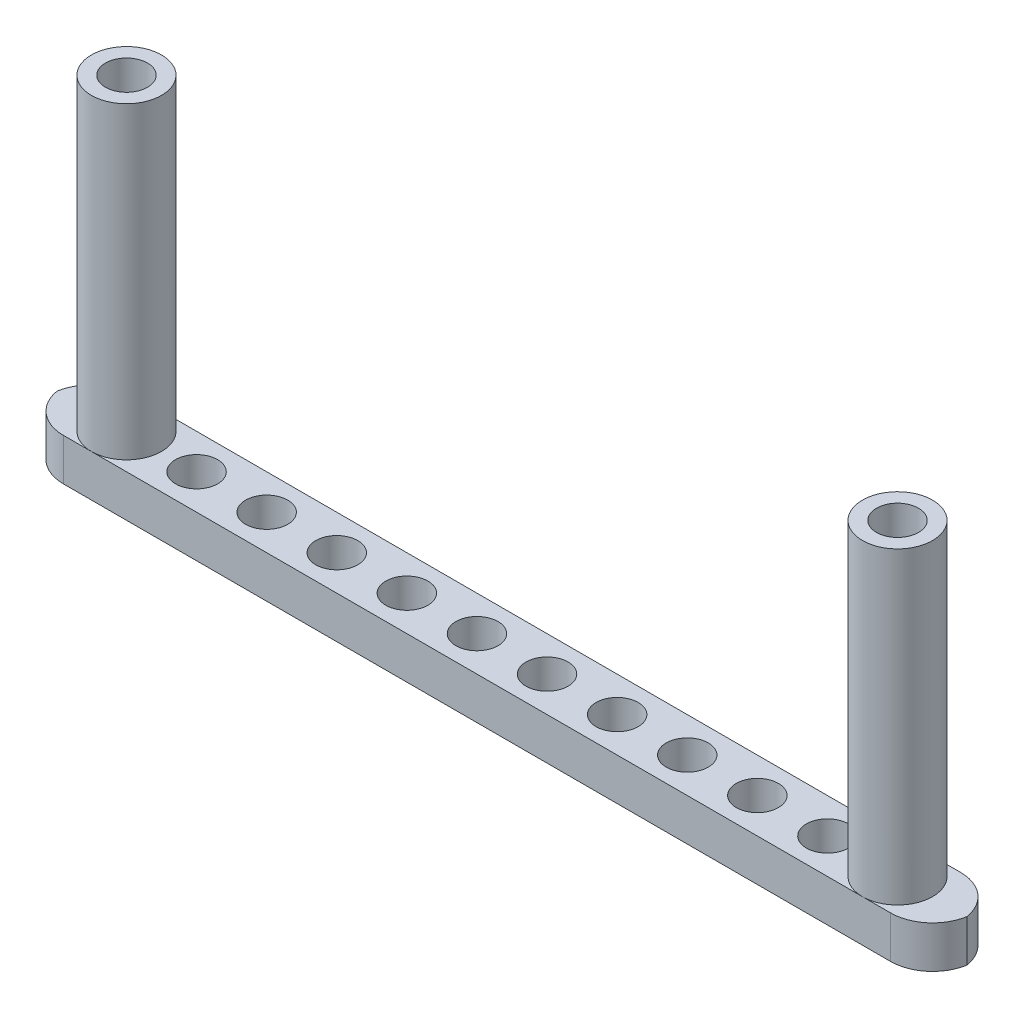
ISO-10303-21;
HEADER;
FILE_DESCRIPTION(('STEP AP214'),'2;1');
FILE_NAME('part.step','',(''),(''),'','','');
FILE_SCHEMA(('AUTOMOTIVE_DESIGN { 1 0 10303 214 1 1 1 1 }'));
ENDSEC;
DATA;
#1=APPLICATION_CONTEXT('core data for automotive mechanical design processes');
#2=APPLICATION_PROTOCOL_DEFINITION('international standard','automotive_design',2000,#1);
#3=PRODUCT_CONTEXT('',#1,'mechanical');
#4=PRODUCT('Part','Part','',(#3));
#5=PRODUCT_RELATED_PRODUCT_CATEGORY('part','',(#4));
#6=PRODUCT_DEFINITION_FORMATION('','',#4);
#7=PRODUCT_DEFINITION_CONTEXT('part definition',#1,'design');
#8=PRODUCT_DEFINITION('design','',#6,#7);
#9=PRODUCT_DEFINITION_SHAPE('','',#8);
#10=(LENGTH_UNIT() NAMED_UNIT(*) SI_UNIT(.MILLI.,.METRE.));
#11=(NAMED_UNIT(*) PLANE_ANGLE_UNIT() SI_UNIT($,.RADIAN.));
#12=(NAMED_UNIT(*) SI_UNIT($,.STERADIAN.) SOLID_ANGLE_UNIT());
#13=UNCERTAINTY_MEASURE_WITH_UNIT(LENGTH_MEASURE(1.E-05),#10,'distance_accuracy_value','');
#14=(GEOMETRIC_REPRESENTATION_CONTEXT(3) GLOBAL_UNCERTAINTY_ASSIGNED_CONTEXT((#13)) GLOBAL_UNIT_ASSIGNED_CONTEXT((#10,
#11,#12)) REPRESENTATION_CONTEXT('',''));
#15=CARTESIAN_POINT('',(0.,0.,0.));
#16=DIRECTION('',(0.,0.,1.));
#17=DIRECTION('',(1.,0.,0.));
#18=AXIS2_PLACEMENT_3D('',#15,#16,#17);
#19=CARTESIAN_POINT('',(0.,3.,0.));
#20=DIRECTION('',(0.,-1.,0.));
#21=DIRECTION('',(0.,0.,-1.));
#22=AXIS2_PLACEMENT_3D('',#19,#20,#21);
#23=PLANE('',#22);
#24=CARTESIAN_POINT('',(55.,3.,-2.5));
#25=DIRECTION('',(0.,1.,0.));
#26=DIRECTION('',(0.,0.,1.));
#27=AXIS2_PLACEMENT_3D('',#24,#25,#26);
#28=CIRCLE('',#27,1.5);
#29=CARTESIAN_POINT('',(55.,3.,-0.999999999999997));
#30=VERTEX_POINT('',#29);
#31=EDGE_CURVE('E169',#30,#30,#28,.T.);
#32=ORIENTED_EDGE('',*,*,#31,.F.);
#33=EDGE_LOOP('',(#32));
#34=FACE_BOUND('',#33,.T.);
#35=CARTESIAN_POINT('',(50.,3.,-2.5));
#36=DIRECTION('',(0.,1.,0.));
#37=DIRECTION('',(0.,0.,1.));
#38=AXIS2_PLACEMENT_3D('',#35,#36,#37);
#39=CIRCLE('',#38,1.5);
#40=CARTESIAN_POINT('',(50.,3.,-0.999999999999997));
#41=VERTEX_POINT('',#40);
#42=EDGE_CURVE('E177',#41,#41,#39,.T.);
#43=ORIENTED_EDGE('',*,*,#42,.F.);
#44=EDGE_LOOP('',(#43));
#45=FACE_BOUND('',#44,.T.);
#46=CARTESIAN_POINT('',(45.,3.,-2.5));
#47=DIRECTION('',(0.,1.,0.));
#48=DIRECTION('',(0.,0.,1.));
#49=AXIS2_PLACEMENT_3D('',#46,#47,#48);
#50=CIRCLE('',#49,1.5);
#51=CARTESIAN_POINT('',(45.,3.,-0.999999999999997));
#52=VERTEX_POINT('',#51);
#53=EDGE_CURVE('E185',#52,#52,#50,.T.);
#54=ORIENTED_EDGE('',*,*,#53,.F.);
#55=EDGE_LOOP('',(#54));
#56=FACE_BOUND('',#55,.T.);
#57=CARTESIAN_POINT('',(40.,3.,-2.5));
#58=DIRECTION('',(0.,1.,0.));
#59=DIRECTION('',(0.,0.,1.));
#60=AXIS2_PLACEMENT_3D('',#57,#58,#59);
#61=CIRCLE('',#60,1.5);
#62=CARTESIAN_POINT('',(40.,3.,-0.999999999999997));
#63=VERTEX_POINT('',#62);
#64=EDGE_CURVE('E193',#63,#63,#61,.T.);
#65=ORIENTED_EDGE('',*,*,#64,.F.);
#66=EDGE_LOOP('',(#65));
#67=FACE_BOUND('',#66,.T.);
#68=CARTESIAN_POINT('',(35.,3.,-2.5));
#69=DIRECTION('',(0.,1.,0.));
#70=DIRECTION('',(0.,0.,1.));
#71=AXIS2_PLACEMENT_3D('',#68,#69,#70);
#72=CIRCLE('',#71,1.5);
#73=CARTESIAN_POINT('',(35.,3.,-0.999999999999997));
#74=VERTEX_POINT('',#73);
#75=EDGE_CURVE('E201',#74,#74,#72,.T.);
#76=ORIENTED_EDGE('',*,*,#75,.F.);
#77=EDGE_LOOP('',(#76));
#78=FACE_BOUND('',#77,.T.);
#79=CARTESIAN_POINT('',(30.,3.,-2.5));
#80=DIRECTION('',(0.,1.,0.));
#81=DIRECTION('',(0.,0.,1.));
#82=AXIS2_PLACEMENT_3D('',#79,#80,#81);
#83=CIRCLE('',#82,1.5);
#84=CARTESIAN_POINT('',(30.,3.,-1.));
#85=VERTEX_POINT('',#84);
#86=EDGE_CURVE('E209',#85,#85,#83,.T.);
#87=ORIENTED_EDGE('',*,*,#86,.F.);
#88=EDGE_LOOP('',(#87));
#89=FACE_BOUND('',#88,.T.);
#90=CARTESIAN_POINT('',(25.,3.,-2.5));
#91=DIRECTION('',(0.,1.,0.));
#92=DIRECTION('',(0.,0.,1.));
#93=AXIS2_PLACEMENT_3D('',#90,#91,#92);
#94=CIRCLE('',#93,1.5);
#95=CARTESIAN_POINT('',(25.,3.,-1.));
#96=VERTEX_POINT('',#95);
#97=EDGE_CURVE('E217',#96,#96,#94,.T.);
#98=ORIENTED_EDGE('',*,*,#97,.F.);
#99=EDGE_LOOP('',(#98));
#100=FACE_BOUND('',#99,.T.);
#101=CARTESIAN_POINT('',(20.,3.,-2.5));
#102=DIRECTION('',(0.,1.,0.));
#103=DIRECTION('',(0.,0.,1.));
#104=AXIS2_PLACEMENT_3D('',#101,#102,#103);
#105=CIRCLE('',#104,1.5);
#106=CARTESIAN_POINT('',(20.,3.,-1.));
#107=VERTEX_POINT('',#106);
#108=EDGE_CURVE('E225',#107,#107,#105,.T.);
#109=ORIENTED_EDGE('',*,*,#108,.F.);
#110=EDGE_LOOP('',(#109));
#111=FACE_BOUND('',#110,.T.);
#112=CARTESIAN_POINT('',(15.,3.,-2.5));
#113=DIRECTION('',(0.,1.,0.));
#114=DIRECTION('',(0.,0.,1.));
#115=AXIS2_PLACEMENT_3D('',#112,#113,#114);
#116=CIRCLE('',#115,1.5);
#117=CARTESIAN_POINT('',(15.,3.,-1.));
#118=VERTEX_POINT('',#117);
#119=EDGE_CURVE('E233',#118,#118,#116,.T.);
#120=ORIENTED_EDGE('',*,*,#119,.F.);
#121=EDGE_LOOP('',(#120));
#122=FACE_BOUND('',#121,.T.);
#123=CARTESIAN_POINT('',(10.,3.,-2.5));
#124=DIRECTION('',(0.,1.,0.));
#125=DIRECTION('',(0.,0.,1.));
#126=AXIS2_PLACEMENT_3D('',#123,#124,#125);
#127=CIRCLE('',#126,1.5);
#128=CARTESIAN_POINT('',(10.,3.,-1.));
#129=VERTEX_POINT('',#128);
#130=EDGE_CURVE('E241',#129,#129,#127,.T.);
#131=ORIENTED_EDGE('',*,*,#130,.F.);
#132=EDGE_LOOP('',(#131));
#133=FACE_BOUND('',#132,.T.);
#134=CARTESIAN_POINT('',(60.,3.,-2.5));
#135=DIRECTION('',(0.,1.,0.));
#136=DIRECTION('',(0.,0.,1.));
#137=AXIS2_PLACEMENT_3D('',#134,#135,#136);
#138=CIRCLE('',#137,2.5);
#139=CARTESIAN_POINT('',(60.,3.,-5.));
#140=VERTEX_POINT('',#139);
#141=CARTESIAN_POINT('',(60.,3.,0.));
#142=VERTEX_POINT('',#141);
#143=EDGE_CURVE('E135',#140,#142,#138,.T.);
#144=ORIENTED_EDGE('',*,*,#143,.F.);
#145=DIRECTION('',(-1.,0.,0.));
#146=VECTOR('',#145,1.);
#147=CARTESIAN_POINT('',(0.,3.,-5.));
#148=LINE('',#147,#146);
#149=CARTESIAN_POINT('',(5.,3.,-5.));
#150=VERTEX_POINT('',#149);
#151=EDGE_CURVE('E121',#140,#150,#148,.T.);
#152=ORIENTED_EDGE('',*,*,#151,.T.);
#153=CARTESIAN_POINT('',(5.,3.,-2.5));
#154=DIRECTION('',(0.,1.,0.));
#155=DIRECTION('',(0.,0.,1.));
#156=AXIS2_PLACEMENT_3D('',#153,#154,#155);
#157=CIRCLE('',#156,2.5);
#158=CARTESIAN_POINT('',(5.,3.,0.));
#159=VERTEX_POINT('',#158);
#160=EDGE_CURVE('E157',#159,#150,#157,.T.);
#161=ORIENTED_EDGE('',*,*,#160,.F.);
#162=DIRECTION('',(1.,0.,0.));
#163=VECTOR('',#162,1.);
#164=CARTESIAN_POINT('',(0.,3.,0.));
#165=LINE('',#164,#163);
#166=EDGE_CURVE('E137',#159,#142,#165,.T.);
#167=ORIENTED_EDGE('',*,*,#166,.T.);
#168=EDGE_LOOP('',(#144,#152,#161,#167));
#169=FACE_BOUND('',#168,.T.);
#170=ADVANCED_FACE('F45',(#34,#45,#56,#67,#78,#89,#100,#111,#122,#133,#169),#23,.F.);
#171=CARTESIAN_POINT('',(62.,3.,-3.));
#172=DIRECTION('',(0.,-1.,0.));
#173=DIRECTION('',(0.,0.,-1.));
#174=AXIS2_PLACEMENT_3D('',#171,#172,#173);
#175=CIRCLE('',#174,3.);
#176=CARTESIAN_POINT('',(62.,3.,0.));
#177=VERTEX_POINT('',#176);
#178=CARTESIAN_POINT('',(64.9580398915498,3.,-2.5));
#179=VERTEX_POINT('',#178);
#180=EDGE_CURVE('E282',#177,#179,#175,.F.);
#181=ORIENTED_EDGE('',*,*,#180,.T.);
#182=CARTESIAN_POINT('',(62.,3.,-2.));
#183=DIRECTION('',(0.,-1.,0.));
#184=DIRECTION('',(0.,0.,-1.));
#185=AXIS2_PLACEMENT_3D('',#182,#183,#184);
#186=CIRCLE('',#185,3.);
#187=CARTESIAN_POINT('',(62.,3.,-5.));
#188=VERTEX_POINT('',#187);
#189=EDGE_CURVE('E115',#179,#188,#186,.F.);
#190=ORIENTED_EDGE('',*,*,#189,.T.);
#191=EDGE_CURVE('E107',#188,#140,#148,.T.);
#192=ORIENTED_EDGE('',*,*,#191,.T.);
#193=EDGE_CURVE('E112',#142,#140,#138,.T.);
#194=ORIENTED_EDGE('',*,*,#193,.F.);
#195=EDGE_CURVE('E255',#142,#177,#165,.T.);
#196=ORIENTED_EDGE('',*,*,#195,.T.);
#197=EDGE_LOOP('',(#181,#190,#192,#194,#196));
#198=FACE_BOUND('',#197,.T.);
#199=ADVANCED_FACE('F109',(#198),#23,.F.);
#200=CARTESIAN_POINT('',(3.,3.,-5.));
#201=VERTEX_POINT('',#200);
#202=EDGE_CURVE('E123',#150,#201,#148,.T.);
#203=ORIENTED_EDGE('',*,*,#202,.T.);
#204=CARTESIAN_POINT('',(3.,3.,-2.));
#205=DIRECTION('',(0.,-1.,0.));
#206=DIRECTION('',(0.,0.,-1.));
#207=AXIS2_PLACEMENT_3D('',#204,#205,#206);
#208=CIRCLE('',#207,3.);
#209=CARTESIAN_POINT('',(0.0419601084501921,3.,-2.5));
#210=VERTEX_POINT('',#209);
#211=EDGE_CURVE('E11',#201,#210,#208,.F.);
#212=ORIENTED_EDGE('',*,*,#211,.T.);
#213=CARTESIAN_POINT('',(3.,3.,-3.));
#214=DIRECTION('',(0.,-1.,0.));
#215=DIRECTION('',(0.,0.,-1.));
#216=AXIS2_PLACEMENT_3D('',#213,#214,#215);
#217=CIRCLE('',#216,3.);
#218=CARTESIAN_POINT('',(3.,3.,0.));
#219=VERTEX_POINT('',#218);
#220=EDGE_CURVE('E55',#210,#219,#217,.F.);
#221=ORIENTED_EDGE('',*,*,#220,.T.);
#222=EDGE_CURVE('E253',#219,#159,#165,.T.);
#223=ORIENTED_EDGE('',*,*,#222,.T.);
#224=EDGE_CURVE('E120',#150,#159,#157,.T.);
#225=ORIENTED_EDGE('',*,*,#224,.F.);
#226=EDGE_LOOP('',(#203,#212,#221,#223,#225));
#227=FACE_BOUND('',#226,.T.);
#228=ADVANCED_FACE('F327',(#227),#23,.F.);
#229=CARTESIAN_POINT('',(0.,0.,0.));
#230=DIRECTION('',(0.,-1.,0.));
#231=DIRECTION('',(0.,0.,-1.));
#232=AXIS2_PLACEMENT_3D('',#229,#230,#231);
#233=PLANE('',#232);
#234=CARTESIAN_POINT('',(55.,0.,-2.5));
#235=DIRECTION('',(0.,1.,0.));
#236=DIRECTION('',(0.,0.,1.));
#237=AXIS2_PLACEMENT_3D('',#234,#235,#236);
#238=CIRCLE('',#237,1.5);
#239=CARTESIAN_POINT('',(55.,0.,-0.999999999999997));
#240=VERTEX_POINT('',#239);
#241=EDGE_CURVE('E168',#240,#240,#238,.T.);
#242=ORIENTED_EDGE('',*,*,#241,.T.);
#243=EDGE_LOOP('',(#242));
#244=FACE_BOUND('',#243,.T.);
#245=CARTESIAN_POINT('',(45.,0.,-2.5));
#246=DIRECTION('',(0.,1.,0.));
#247=DIRECTION('',(0.,0.,1.));
#248=AXIS2_PLACEMENT_3D('',#245,#246,#247);
#249=CIRCLE('',#248,1.5);
#250=CARTESIAN_POINT('',(45.,0.,-0.999999999999997));
#251=VERTEX_POINT('',#250);
#252=EDGE_CURVE('E181',#251,#251,#249,.T.);
#253=ORIENTED_EDGE('',*,*,#252,.T.);
#254=EDGE_LOOP('',(#253));
#255=FACE_BOUND('',#254,.T.);
#256=CARTESIAN_POINT('',(35.,0.,-2.5));
#257=DIRECTION('',(0.,1.,0.));
#258=DIRECTION('',(0.,0.,1.));
#259=AXIS2_PLACEMENT_3D('',#256,#257,#258);
#260=CIRCLE('',#259,1.5);
#261=CARTESIAN_POINT('',(35.,0.,-0.999999999999997));
#262=VERTEX_POINT('',#261);
#263=EDGE_CURVE('E197',#262,#262,#260,.T.);
#264=ORIENTED_EDGE('',*,*,#263,.T.);
#265=EDGE_LOOP('',(#264));
#266=FACE_BOUND('',#265,.T.);
#267=CARTESIAN_POINT('',(25.,0.,-2.5));
#268=DIRECTION('',(0.,1.,0.));
#269=DIRECTION('',(0.,0.,1.));
#270=AXIS2_PLACEMENT_3D('',#267,#268,#269);
#271=CIRCLE('',#270,1.5);
#272=CARTESIAN_POINT('',(25.,0.,-1.));
#273=VERTEX_POINT('',#272);
#274=EDGE_CURVE('E213',#273,#273,#271,.T.);
#275=ORIENTED_EDGE('',*,*,#274,.T.);
#276=EDGE_LOOP('',(#275));
#277=FACE_BOUND('',#276,.T.);
#278=CARTESIAN_POINT('',(15.,0.,-2.5));
#279=DIRECTION('',(0.,1.,0.));
#280=DIRECTION('',(0.,0.,1.));
#281=AXIS2_PLACEMENT_3D('',#278,#279,#280);
#282=CIRCLE('',#281,1.5);
#283=CARTESIAN_POINT('',(15.,0.,-1.));
#284=VERTEX_POINT('',#283);
#285=EDGE_CURVE('E229',#284,#284,#282,.T.);
#286=ORIENTED_EDGE('',*,*,#285,.T.);
#287=EDGE_LOOP('',(#286));
#288=FACE_BOUND('',#287,.T.);
#289=CARTESIAN_POINT('',(5.,0.,-2.5));
#290=DIRECTION('',(0.,1.,0.));
#291=DIRECTION('',(0.,0.,1.));
#292=AXIS2_PLACEMENT_3D('',#289,#290,#291);
#293=CIRCLE('',#292,1.5);
#294=CARTESIAN_POINT('',(5.,0.,-1.));
#295=VERTEX_POINT('',#294);
#296=EDGE_CURVE('E245',#295,#295,#293,.T.);
#297=ORIENTED_EDGE('',*,*,#296,.T.);
#298=EDGE_LOOP('',(#297));
#299=FACE_BOUND('',#298,.T.);
#300=DIRECTION('',(-1.,0.,0.));
#301=VECTOR('',#300,1.);
#302=CARTESIAN_POINT('',(0.,0.,-5.));
#303=LINE('',#302,#301);
#304=CARTESIAN_POINT('',(62.,0.,-5.));
#305=VERTEX_POINT('',#304);
#306=CARTESIAN_POINT('',(3.,0.,-5.));
#307=VERTEX_POINT('',#306);
#308=EDGE_CURVE('E260',#305,#307,#303,.T.);
#309=ORIENTED_EDGE('',*,*,#308,.F.);
#310=CARTESIAN_POINT('',(62.,0.,-2.));
#311=DIRECTION('',(0.,-1.,0.));
#312=DIRECTION('',(0.,0.,-1.));
#313=AXIS2_PLACEMENT_3D('',#310,#311,#312);
#314=CIRCLE('',#313,3.);
#315=CARTESIAN_POINT('',(64.9580398915498,0.,-2.5));
#316=VERTEX_POINT('',#315);
#317=EDGE_CURVE('E279',#305,#316,#314,.T.);
#318=ORIENTED_EDGE('',*,*,#317,.T.);
#319=CARTESIAN_POINT('',(62.,0.,-3.));
#320=DIRECTION('',(0.,-1.,0.));
#321=DIRECTION('',(0.,0.,-1.));
#322=AXIS2_PLACEMENT_3D('',#319,#320,#321);
#323=CIRCLE('',#322,3.);
#324=CARTESIAN_POINT('',(62.,0.,0.));
#325=VERTEX_POINT('',#324);
#326=EDGE_CURVE('E276',#316,#325,#323,.T.);
#327=ORIENTED_EDGE('',*,*,#326,.T.);
#328=DIRECTION('',(1.,0.,0.));
#329=VECTOR('',#328,1.);
#330=CARTESIAN_POINT('',(0.,0.,0.));
#331=LINE('',#330,#329);
#332=CARTESIAN_POINT('',(3.,0.,0.));
#333=VERTEX_POINT('',#332);
#334=EDGE_CURVE('E252',#333,#325,#331,.T.);
#335=ORIENTED_EDGE('',*,*,#334,.F.);
#336=CARTESIAN_POINT('',(3.,0.,-3.));
#337=DIRECTION('',(0.,-1.,0.));
#338=DIRECTION('',(0.,0.,-1.));
#339=AXIS2_PLACEMENT_3D('',#336,#337,#338);
#340=CIRCLE('',#339,3.);
#341=CARTESIAN_POINT('',(0.0419601084501921,0.,-2.5));
#342=VERTEX_POINT('',#341);
#343=EDGE_CURVE('E270',#333,#342,#340,.T.);
#344=ORIENTED_EDGE('',*,*,#343,.T.);
#345=CARTESIAN_POINT('',(3.,0.,-2.));
#346=DIRECTION('',(0.,-1.,0.));
#347=DIRECTION('',(0.,0.,-1.));
#348=AXIS2_PLACEMENT_3D('',#345,#346,#347);
#349=CIRCLE('',#348,3.);
#350=EDGE_CURVE('E273',#342,#307,#349,.T.);
#351=ORIENTED_EDGE('',*,*,#350,.T.);
#352=EDGE_LOOP('',(#309,#318,#327,#335,#344,#351));
#353=FACE_BOUND('',#352,.T.);
#354=CARTESIAN_POINT('',(10.,0.,-2.5));
#355=DIRECTION('',(0.,1.,0.));
#356=DIRECTION('',(0.,0.,1.));
#357=AXIS2_PLACEMENT_3D('',#354,#355,#356);
#358=CIRCLE('',#357,1.5);
#359=CARTESIAN_POINT('',(10.,0.,-1.));
#360=VERTEX_POINT('',#359);
#361=EDGE_CURVE('E237',#360,#360,#358,.T.);
#362=ORIENTED_EDGE('',*,*,#361,.T.);
#363=EDGE_LOOP('',(#362));
#364=FACE_BOUND('',#363,.T.);
#365=CARTESIAN_POINT('',(20.,0.,-2.5));
#366=DIRECTION('',(0.,1.,0.));
#367=DIRECTION('',(0.,0.,1.));
#368=AXIS2_PLACEMENT_3D('',#365,#366,#367);
#369=CIRCLE('',#368,1.5);
#370=CARTESIAN_POINT('',(20.,0.,-1.));
#371=VERTEX_POINT('',#370);
#372=EDGE_CURVE('E221',#371,#371,#369,.T.);
#373=ORIENTED_EDGE('',*,*,#372,.T.);
#374=EDGE_LOOP('',(#373));
#375=FACE_BOUND('',#374,.T.);
#376=CARTESIAN_POINT('',(30.,0.,-2.5));
#377=DIRECTION('',(0.,1.,0.));
#378=DIRECTION('',(0.,0.,1.));
#379=AXIS2_PLACEMENT_3D('',#376,#377,#378);
#380=CIRCLE('',#379,1.5);
#381=CARTESIAN_POINT('',(30.,0.,-1.));
#382=VERTEX_POINT('',#381);
#383=EDGE_CURVE('E205',#382,#382,#380,.T.);
#384=ORIENTED_EDGE('',*,*,#383,.T.);
#385=EDGE_LOOP('',(#384));
#386=FACE_BOUND('',#385,.T.);
#387=CARTESIAN_POINT('',(40.,0.,-2.5));
#388=DIRECTION('',(0.,1.,0.));
#389=DIRECTION('',(0.,0.,1.));
#390=AXIS2_PLACEMENT_3D('',#387,#388,#389);
#391=CIRCLE('',#390,1.5);
#392=CARTESIAN_POINT('',(40.,0.,-0.999999999999997));
#393=VERTEX_POINT('',#392);
#394=EDGE_CURVE('E189',#393,#393,#391,.T.);
#395=ORIENTED_EDGE('',*,*,#394,.T.);
#396=EDGE_LOOP('',(#395));
#397=FACE_BOUND('',#396,.T.);
#398=CARTESIAN_POINT('',(50.,0.,-2.5));
#399=DIRECTION('',(0.,1.,0.));
#400=DIRECTION('',(0.,0.,1.));
#401=AXIS2_PLACEMENT_3D('',#398,#399,#400);
#402=CIRCLE('',#401,1.5);
#403=CARTESIAN_POINT('',(50.,0.,-0.999999999999997));
#404=VERTEX_POINT('',#403);
#405=EDGE_CURVE('E173',#404,#404,#402,.T.);
#406=ORIENTED_EDGE('',*,*,#405,.T.);
#407=EDGE_LOOP('',(#406));
#408=FACE_BOUND('',#407,.T.);
#409=CARTESIAN_POINT('',(60.,0.,-2.5));
#410=DIRECTION('',(0.,1.,0.));
#411=DIRECTION('',(0.,0.,1.));
#412=AXIS2_PLACEMENT_3D('',#409,#410,#411);
#413=CIRCLE('',#412,1.5);
#414=CARTESIAN_POINT('',(60.,0.,-0.999999999999997));
#415=VERTEX_POINT('',#414);
#416=EDGE_CURVE('E162',#415,#415,#413,.T.);
#417=ORIENTED_EDGE('',*,*,#416,.T.);
#418=EDGE_LOOP('',(#417));
#419=FACE_BOUND('',#418,.T.);
#420=ADVANCED_FACE('F314',(#244,#255,#266,#277,#288,#299,#353,#364,#375,#386,#397,#408,#419),
#233,.T.);
#421=CARTESIAN_POINT('',(0.,3.,0.));
#422=DIRECTION('',(0.,0.,-1.));
#423=DIRECTION('',(-1.,0.,0.));
#424=AXIS2_PLACEMENT_3D('',#421,#422,#423);
#425=PLANE('',#424);
#426=ORIENTED_EDGE('',*,*,#334,.T.);
#427=DIRECTION('',(0.,-1.,0.));
#428=VECTOR('',#427,1.);
#429=CARTESIAN_POINT('',(62.,3.,0.));
#430=LINE('',#429,#428);
#431=EDGE_CURVE('E290',#325,#177,#430,.F.);
#432=ORIENTED_EDGE('',*,*,#431,.T.);
#433=ORIENTED_EDGE('',*,*,#195,.F.);
#434=ORIENTED_EDGE('',*,*,#166,.F.);
#435=ORIENTED_EDGE('',*,*,#222,.F.);
#436=DIRECTION('',(0.,-1.,0.));
#437=VECTOR('',#436,1.);
#438=CARTESIAN_POINT('',(3.,3.,0.));
#439=LINE('',#438,#437);
#440=EDGE_CURVE('E287',#219,#333,#439,.T.);
#441=ORIENTED_EDGE('',*,*,#440,.T.);
#442=EDGE_LOOP('',(#426,#432,#433,#434,#435,#441));
#443=FACE_BOUND('',#442,.T.);
#444=ADVANCED_FACE('F310',(#443),#425,.F.);
#445=CARTESIAN_POINT('',(0.,3.,-5.));
#446=DIRECTION('',(0.,0.,1.));
#447=DIRECTION('',(1.,0.,0.));
#448=AXIS2_PLACEMENT_3D('',#445,#446,#447);
#449=PLANE('',#448);
#450=ORIENTED_EDGE('',*,*,#191,.F.);
#451=DIRECTION('',(0.,-1.,0.));
#452=VECTOR('',#451,1.);
#453=CARTESIAN_POINT('',(62.,3.,-5.));
#454=LINE('',#453,#452);
#455=EDGE_CURVE('E267',#188,#305,#454,.T.);
#456=ORIENTED_EDGE('',*,*,#455,.T.);
#457=ORIENTED_EDGE('',*,*,#308,.T.);
#458=DIRECTION('',(0.,-1.,0.));
#459=VECTOR('',#458,1.);
#460=CARTESIAN_POINT('',(3.,3.,-5.));
#461=LINE('',#460,#459);
#462=EDGE_CURVE('E264',#307,#201,#461,.F.);
#463=ORIENTED_EDGE('',*,*,#462,.T.);
#464=ORIENTED_EDGE('',*,*,#202,.F.);
#465=ORIENTED_EDGE('',*,*,#151,.F.);
#466=EDGE_LOOP('',(#450,#456,#457,#463,#464,#465));
#467=FACE_BOUND('',#466,.T.);
#468=ADVANCED_FACE('F126',(#467),#449,.F.);
#469=CARTESIAN_POINT('',(5.,3.,-2.5));
#470=DIRECTION('',(0.,-1.,0.));
#471=DIRECTION('',(0.,0.,-1.));
#472=AXIS2_PLACEMENT_3D('',#469,#470,#471);
#473=CYLINDRICAL_SURFACE('',#472,1.5);
#474=ORIENTED_EDGE('',*,*,#296,.F.);
#475=EDGE_LOOP('',(#474));
#476=FACE_BOUND('',#475,.T.);
#477=CARTESIAN_POINT('',(5.,25.,-2.5));
#478=DIRECTION('',(0.,1.,0.));
#479=DIRECTION('',(0.,0.,1.));
#480=AXIS2_PLACEMENT_3D('',#477,#478,#479);
#481=CIRCLE('',#480,1.5);
#482=CARTESIAN_POINT('',(5.,25.,-1.));
#483=VERTEX_POINT('',#482);
#484=EDGE_CURVE('E147',#483,#483,#481,.T.);
#485=ORIENTED_EDGE('',*,*,#484,.T.);
#486=EDGE_LOOP('',(#485));
#487=FACE_BOUND('',#486,.T.);
#488=ADVANCED_FACE('F367',(#476,#487),#473,.F.);
#489=CARTESIAN_POINT('',(10.,3.,-2.5));
#490=DIRECTION('',(0.,-1.,0.));
#491=DIRECTION('',(0.,0.,-1.));
#492=AXIS2_PLACEMENT_3D('',#489,#490,#491);
#493=CYLINDRICAL_SURFACE('',#492,1.5);
#494=ORIENTED_EDGE('',*,*,#130,.T.);
#495=EDGE_LOOP('',(#494));
#496=FACE_BOUND('',#495,.T.);
#497=ORIENTED_EDGE('',*,*,#361,.F.);
#498=EDGE_LOOP('',(#497));
#499=FACE_BOUND('',#498,.T.);
#500=ADVANCED_FACE('F363',(#496,#499),#493,.F.);
#501=CARTESIAN_POINT('',(15.,3.,-2.5));
#502=DIRECTION('',(0.,-1.,0.));
#503=DIRECTION('',(0.,0.,-1.));
#504=AXIS2_PLACEMENT_3D('',#501,#502,#503);
#505=CYLINDRICAL_SURFACE('',#504,1.5);
#506=ORIENTED_EDGE('',*,*,#119,.T.);
#507=EDGE_LOOP('',(#506));
#508=FACE_BOUND('',#507,.T.);
#509=ORIENTED_EDGE('',*,*,#285,.F.);
#510=EDGE_LOOP('',(#509));
#511=FACE_BOUND('',#510,.T.);
#512=ADVANCED_FACE('F366',(#508,#511),#505,.F.);
#513=CARTESIAN_POINT('',(20.,3.,-2.5));
#514=DIRECTION('',(0.,-1.,0.));
#515=DIRECTION('',(0.,0.,-1.));
#516=AXIS2_PLACEMENT_3D('',#513,#514,#515);
#517=CYLINDRICAL_SURFACE('',#516,1.5);
#518=ORIENTED_EDGE('',*,*,#108,.T.);
#519=EDGE_LOOP('',(#518));
#520=FACE_BOUND('',#519,.T.);
#521=ORIENTED_EDGE('',*,*,#372,.F.);
#522=EDGE_LOOP('',(#521));
#523=FACE_BOUND('',#522,.T.);
#524=ADVANCED_FACE('F430',(#520,#523),#517,.F.);
#525=CARTESIAN_POINT('',(25.,3.,-2.5));
#526=DIRECTION('',(0.,-1.,0.));
#527=DIRECTION('',(0.,0.,-1.));
#528=AXIS2_PLACEMENT_3D('',#525,#526,#527);
#529=CYLINDRICAL_SURFACE('',#528,1.5);
#530=ORIENTED_EDGE('',*,*,#97,.T.);
#531=EDGE_LOOP('',(#530));
#532=FACE_BOUND('',#531,.T.);
#533=ORIENTED_EDGE('',*,*,#274,.F.);
#534=EDGE_LOOP('',(#533));
#535=FACE_BOUND('',#534,.T.);
#536=ADVANCED_FACE('F426',(#532,#535),#529,.F.);
#537=CARTESIAN_POINT('',(30.,3.,-2.5));
#538=DIRECTION('',(0.,-1.,0.));
#539=DIRECTION('',(0.,0.,-1.));
#540=AXIS2_PLACEMENT_3D('',#537,#538,#539);
#541=CYLINDRICAL_SURFACE('',#540,1.5);
#542=ORIENTED_EDGE('',*,*,#86,.T.);
#543=EDGE_LOOP('',(#542));
#544=FACE_BOUND('',#543,.T.);
#545=ORIENTED_EDGE('',*,*,#383,.F.);
#546=EDGE_LOOP('',(#545));
#547=FACE_BOUND('',#546,.T.);
#548=ADVANCED_FACE('F422',(#544,#547),#541,.F.);
#549=CARTESIAN_POINT('',(35.,3.,-2.5));
#550=DIRECTION('',(0.,-1.,0.));
#551=DIRECTION('',(0.,0.,-1.));
#552=AXIS2_PLACEMENT_3D('',#549,#550,#551);
#553=CYLINDRICAL_SURFACE('',#552,1.5);
#554=ORIENTED_EDGE('',*,*,#75,.T.);
#555=EDGE_LOOP('',(#554));
#556=FACE_BOUND('',#555,.T.);
#557=ORIENTED_EDGE('',*,*,#263,.F.);
#558=EDGE_LOOP('',(#557));
#559=FACE_BOUND('',#558,.T.);
#560=ADVANCED_FACE('F418',(#556,#559),#553,.F.);
#561=CARTESIAN_POINT('',(40.,3.,-2.5));
#562=DIRECTION('',(0.,-1.,0.));
#563=DIRECTION('',(0.,0.,-1.));
#564=AXIS2_PLACEMENT_3D('',#561,#562,#563);
#565=CYLINDRICAL_SURFACE('',#564,1.5);
#566=ORIENTED_EDGE('',*,*,#64,.T.);
#567=EDGE_LOOP('',(#566));
#568=FACE_BOUND('',#567,.T.);
#569=ORIENTED_EDGE('',*,*,#394,.F.);
#570=EDGE_LOOP('',(#569));
#571=FACE_BOUND('',#570,.T.);
#572=ADVANCED_FACE('F414',(#568,#571),#565,.F.);
#573=CARTESIAN_POINT('',(45.,3.,-2.5));
#574=DIRECTION('',(0.,-1.,0.));
#575=DIRECTION('',(0.,0.,-1.));
#576=AXIS2_PLACEMENT_3D('',#573,#574,#575);
#577=CYLINDRICAL_SURFACE('',#576,1.5);
#578=ORIENTED_EDGE('',*,*,#53,.T.);
#579=EDGE_LOOP('',(#578));
#580=FACE_BOUND('',#579,.T.);
#581=ORIENTED_EDGE('',*,*,#252,.F.);
#582=EDGE_LOOP('',(#581));
#583=FACE_BOUND('',#582,.T.);
#584=ADVANCED_FACE('F410',(#580,#583),#577,.F.);
#585=CARTESIAN_POINT('',(50.,3.,-2.5));
#586=DIRECTION('',(0.,-1.,0.));
#587=DIRECTION('',(0.,0.,-1.));
#588=AXIS2_PLACEMENT_3D('',#585,#586,#587);
#589=CYLINDRICAL_SURFACE('',#588,1.5);
#590=ORIENTED_EDGE('',*,*,#42,.T.);
#591=EDGE_LOOP('',(#590));
#592=FACE_BOUND('',#591,.T.);
#593=ORIENTED_EDGE('',*,*,#405,.F.);
#594=EDGE_LOOP('',(#593));
#595=FACE_BOUND('',#594,.T.);
#596=ADVANCED_FACE('F406',(#592,#595),#589,.F.);
#597=CARTESIAN_POINT('',(55.,3.,-2.5));
#598=DIRECTION('',(0.,-1.,0.));
#599=DIRECTION('',(0.,0.,-1.));
#600=AXIS2_PLACEMENT_3D('',#597,#598,#599);
#601=CYLINDRICAL_SURFACE('',#600,1.5);
#602=ORIENTED_EDGE('',*,*,#31,.T.);
#603=EDGE_LOOP('',(#602));
#604=FACE_BOUND('',#603,.T.);
#605=ORIENTED_EDGE('',*,*,#241,.F.);
#606=EDGE_LOOP('',(#605));
#607=FACE_BOUND('',#606,.T.);
#608=ADVANCED_FACE('F385',(#604,#607),#601,.F.);
#609=CARTESIAN_POINT('',(60.,3.,-2.5));
#610=DIRECTION('',(0.,-1.,0.));
#611=DIRECTION('',(0.,0.,-1.));
#612=AXIS2_PLACEMENT_3D('',#609,#610,#611);
#613=CYLINDRICAL_SURFACE('',#612,1.5);
#614=ORIENTED_EDGE('',*,*,#416,.F.);
#615=EDGE_LOOP('',(#614));
#616=FACE_BOUND('',#615,.T.);
#617=CARTESIAN_POINT('',(60.,25.,-2.5));
#618=DIRECTION('',(0.,1.,0.));
#619=DIRECTION('',(0.,0.,1.));
#620=AXIS2_PLACEMENT_3D('',#617,#618,#619);
#621=CIRCLE('',#620,1.5);
#622=CARTESIAN_POINT('',(60.,25.,-0.999999999999997));
#623=VERTEX_POINT('',#622);
#624=EDGE_CURVE('E144',#623,#623,#621,.T.);
#625=ORIENTED_EDGE('',*,*,#624,.T.);
#626=EDGE_LOOP('',(#625));
#627=FACE_BOUND('',#626,.T.);
#628=ADVANCED_FACE('F381',(#616,#627),#613,.F.);
#629=CARTESIAN_POINT('',(5.,25.,-2.5));
#630=DIRECTION('',(0.,1.,0.));
#631=DIRECTION('',(0.,0.,1.));
#632=AXIS2_PLACEMENT_3D('',#629,#630,#631);
#633=PLANE('',#632);
#634=CARTESIAN_POINT('',(5.,25.,-2.5));
#635=DIRECTION('',(0.,1.,0.));
#636=DIRECTION('',(0.,0.,1.));
#637=AXIS2_PLACEMENT_3D('',#634,#635,#636);
#638=CIRCLE('',#637,2.5);
#639=CARTESIAN_POINT('',(5.,25.,0.));
#640=VERTEX_POINT('',#639);
#641=EDGE_CURVE('E158',#640,#640,#638,.T.);
#642=ORIENTED_EDGE('',*,*,#641,.T.);
#643=EDGE_LOOP('',(#642));
#644=FACE_BOUND('',#643,.T.);
#645=ORIENTED_EDGE('',*,*,#484,.F.);
#646=EDGE_LOOP('',(#645));
#647=FACE_BOUND('',#646,.T.);
#648=ADVANCED_FACE('F384',(#644,#647),#633,.T.);
#649=CARTESIAN_POINT('',(5.,25.,-2.5));
#650=DIRECTION('',(0.,-1.,0.));
#651=DIRECTION('',(0.,0.,-1.));
#652=AXIS2_PLACEMENT_3D('',#649,#650,#651);
#653=CYLINDRICAL_SURFACE('',#652,2.5);
#654=ORIENTED_EDGE('',*,*,#641,.F.);
#655=EDGE_LOOP('',(#654));
#656=FACE_BOUND('',#655,.T.);
#657=ORIENTED_EDGE('',*,*,#160,.T.);
#658=ORIENTED_EDGE('',*,*,#224,.T.);
#659=EDGE_LOOP('',(#657,#658));
#660=FACE_BOUND('',#659,.T.);
#661=ADVANCED_FACE('F326',(#656,#660),#653,.T.);
#662=CARTESIAN_POINT('',(60.,25.,-2.5));
#663=DIRECTION('',(0.,1.,0.));
#664=DIRECTION('',(0.,0.,1.));
#665=AXIS2_PLACEMENT_3D('',#662,#663,#664);
#666=PLANE('',#665);
#667=CARTESIAN_POINT('',(60.,25.,-2.5));
#668=DIRECTION('',(0.,1.,0.));
#669=DIRECTION('',(0.,0.,1.));
#670=AXIS2_PLACEMENT_3D('',#667,#668,#669);
#671=CIRCLE('',#670,2.5);
#672=CARTESIAN_POINT('',(60.,25.,0.));
#673=VERTEX_POINT('',#672);
#674=EDGE_CURVE('E140',#673,#673,#671,.T.);
#675=ORIENTED_EDGE('',*,*,#674,.T.);
#676=EDGE_LOOP('',(#675));
#677=FACE_BOUND('',#676,.T.);
#678=ORIENTED_EDGE('',*,*,#624,.F.);
#679=EDGE_LOOP('',(#678));
#680=FACE_BOUND('',#679,.T.);
#681=ADVANCED_FACE('F389',(#677,#680),#666,.T.);
#682=CARTESIAN_POINT('',(60.,25.,-2.5));
#683=DIRECTION('',(0.,-1.,0.));
#684=DIRECTION('',(0.,0.,-1.));
#685=AXIS2_PLACEMENT_3D('',#682,#683,#684);
#686=CYLINDRICAL_SURFACE('',#685,2.5);
#687=ORIENTED_EDGE('',*,*,#674,.F.);
#688=EDGE_LOOP('',(#687));
#689=FACE_BOUND('',#688,.T.);
#690=ORIENTED_EDGE('',*,*,#193,.T.);
#691=ORIENTED_EDGE('',*,*,#143,.T.);
#692=EDGE_LOOP('',(#690,#691));
#693=FACE_BOUND('',#692,.T.);
#694=ADVANCED_FACE('F142',(#689,#693),#686,.T.);
#695=CARTESIAN_POINT('',(62.,3.,-3.));
#696=DIRECTION('',(0.,-1.,0.));
#697=DIRECTION('',(0.,0.,-1.));
#698=AXIS2_PLACEMENT_3D('',#695,#696,#697);
#699=CYLINDRICAL_SURFACE('',#698,3.);
#700=DIRECTION('',(0.,-1.,0.));
#701=VECTOR('',#700,1.);
#702=CARTESIAN_POINT('',(64.9580398915498,1.5,-2.5));
#703=LINE('',#702,#701);
#704=EDGE_CURVE('E152',#179,#316,#703,.T.);
#705=ORIENTED_EDGE('',*,*,#704,.F.);
#706=ORIENTED_EDGE('',*,*,#180,.F.);
#707=ORIENTED_EDGE('',*,*,#431,.F.);
#708=ORIENTED_EDGE('',*,*,#326,.F.);
#709=EDGE_LOOP('',(#705,#706,#707,#708));
#710=FACE_BOUND('',#709,.T.);
#711=ADVANCED_FACE('F318',(#710),#699,.T.);
#712=CARTESIAN_POINT('',(62.,3.,-2.));
#713=DIRECTION('',(0.,-1.,0.));
#714=DIRECTION('',(0.,0.,-1.));
#715=AXIS2_PLACEMENT_3D('',#712,#713,#714);
#716=CYLINDRICAL_SURFACE('',#715,3.);
#717=ORIENTED_EDGE('',*,*,#189,.F.);
#718=ORIENTED_EDGE('',*,*,#704,.T.);
#719=ORIENTED_EDGE('',*,*,#317,.F.);
#720=ORIENTED_EDGE('',*,*,#455,.F.);
#721=EDGE_LOOP('',(#717,#718,#719,#720));
#722=FACE_BOUND('',#721,.T.);
#723=ADVANCED_FACE('F453',(#722),#716,.T.);
#724=CARTESIAN_POINT('',(3.,3.,-3.));
#725=DIRECTION('',(0.,-1.,0.));
#726=DIRECTION('',(0.,0.,-1.));
#727=AXIS2_PLACEMENT_3D('',#724,#725,#726);
#728=CYLINDRICAL_SURFACE('',#727,3.);
#729=ORIENTED_EDGE('',*,*,#440,.F.);
#730=ORIENTED_EDGE('',*,*,#220,.F.);
#731=DIRECTION('',(0.,-1.,0.));
#732=VECTOR('',#731,1.);
#733=CARTESIAN_POINT('',(0.0419601084501913,1.5,-2.5));
#734=LINE('',#733,#732);
#735=EDGE_CURVE('E49',#342,#210,#734,.F.);
#736=ORIENTED_EDGE('',*,*,#735,.F.);
#737=ORIENTED_EDGE('',*,*,#343,.F.);
#738=EDGE_LOOP('',(#729,#730,#736,#737));
#739=FACE_BOUND('',#738,.T.);
#740=ADVANCED_FACE('F47',(#739),#728,.T.);
#741=CARTESIAN_POINT('',(3.,3.,-2.));
#742=DIRECTION('',(0.,-1.,0.));
#743=DIRECTION('',(0.,0.,-1.));
#744=AXIS2_PLACEMENT_3D('',#741,#742,#743);
#745=CYLINDRICAL_SURFACE('',#744,3.);
#746=ORIENTED_EDGE('',*,*,#211,.F.);
#747=ORIENTED_EDGE('',*,*,#462,.F.);
#748=ORIENTED_EDGE('',*,*,#350,.F.);
#749=ORIENTED_EDGE('',*,*,#735,.T.);
#750=EDGE_LOOP('',(#746,#747,#748,#749));
#751=FACE_BOUND('',#750,.T.);
#752=ADVANCED_FACE('F303',(#751),#745,.T.);
#753=CLOSED_SHELL('',(#170,#199,#228,#420,#444,#468,#488,#500,#512,#524,#536,#548,#560,#572,
#584,#596,#608,#628,#648,#661,#681,#694,#711,#723,#740,#752));
#754=MANIFOLD_SOLID_BREP('B2',#753);
#755=ADVANCED_BREP_SHAPE_REPRESENTATION('',(#18,#754),#14);
#756=SHAPE_DEFINITION_REPRESENTATION(#9,#755);
ENDSEC;
END-ISO-10303-21;
